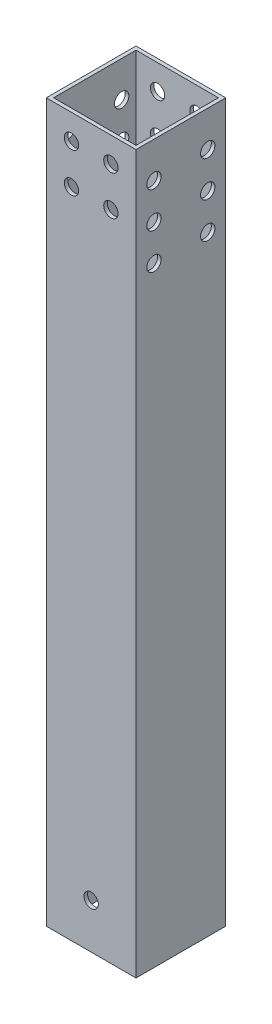
ISO-10303-21;
HEADER;
FILE_DESCRIPTION(('STEP AP214'),'2;1');
FILE_NAME('part.step','',(''),(''),'','','');
FILE_SCHEMA(('AUTOMOTIVE_DESIGN { 1 0 10303 214 1 1 1 1 }'));
ENDSEC;
DATA;
#1=APPLICATION_CONTEXT('core data for automotive mechanical design processes');
#2=APPLICATION_PROTOCOL_DEFINITION('international standard','automotive_design',2000,#1);
#3=PRODUCT_CONTEXT('',#1,'mechanical');
#4=PRODUCT('Part','Part','',(#3));
#5=PRODUCT_RELATED_PRODUCT_CATEGORY('part','',(#4));
#6=PRODUCT_DEFINITION_FORMATION('','',#4);
#7=PRODUCT_DEFINITION_CONTEXT('part definition',#1,'design');
#8=PRODUCT_DEFINITION('design','',#6,#7);
#9=PRODUCT_DEFINITION_SHAPE('','',#8);
#10=(LENGTH_UNIT() NAMED_UNIT(*) SI_UNIT(.MILLI.,.METRE.));
#11=(NAMED_UNIT(*) PLANE_ANGLE_UNIT() SI_UNIT($,.RADIAN.));
#12=(NAMED_UNIT(*) SI_UNIT($,.STERADIAN.) SOLID_ANGLE_UNIT());
#13=UNCERTAINTY_MEASURE_WITH_UNIT(LENGTH_MEASURE(1.E-05),#10,'distance_accuracy_value','');
#14=(GEOMETRIC_REPRESENTATION_CONTEXT(3) GLOBAL_UNCERTAINTY_ASSIGNED_CONTEXT((#13)) GLOBAL_UNIT_ASSIGNED_CONTEXT((#10,
#11,#12)) REPRESENTATION_CONTEXT('',''));
#15=CARTESIAN_POINT('',(0.,0.,0.));
#16=DIRECTION('',(0.,0.,1.));
#17=DIRECTION('',(1.,0.,0.));
#18=AXIS2_PLACEMENT_3D('',#15,#16,#17);
#19=CARTESIAN_POINT('',(0.,200.,0.));
#20=DIRECTION('',(0.,1.,0.));
#21=DIRECTION('',(0.,0.,1.));
#22=AXIS2_PLACEMENT_3D('',#19,#20,#21);
#23=PLANE('',#22);
#24=DIRECTION('',(0.,0.,-1.));
#25=VECTOR('',#24,1.);
#26=CARTESIAN_POINT('',(12.5,200.,-12.5));
#27=LINE('',#26,#25);
#28=CARTESIAN_POINT('',(12.5,200.,12.5));
#29=VERTEX_POINT('',#28);
#30=CARTESIAN_POINT('',(12.5,200.,-12.5));
#31=VERTEX_POINT('',#30);
#32=EDGE_CURVE('E139',#29,#31,#27,.T.);
#33=ORIENTED_EDGE('',*,*,#32,.T.);
#34=DIRECTION('',(-1.,0.,0.));
#35=VECTOR('',#34,1.);
#36=CARTESIAN_POINT('',(-12.5,200.,-12.5));
#37=LINE('',#36,#35);
#38=CARTESIAN_POINT('',(-12.5,200.,-12.5));
#39=VERTEX_POINT('',#38);
#40=EDGE_CURVE('E142',#31,#39,#37,.T.);
#41=ORIENTED_EDGE('',*,*,#40,.T.);
#42=DIRECTION('',(0.,0.,1.));
#43=VECTOR('',#42,1.);
#44=CARTESIAN_POINT('',(-12.5,200.,-12.5));
#45=LINE('',#44,#43);
#46=CARTESIAN_POINT('',(-12.5,200.,12.5));
#47=VERTEX_POINT('',#46);
#48=EDGE_CURVE('E145',#39,#47,#45,.T.);
#49=ORIENTED_EDGE('',*,*,#48,.T.);
#50=DIRECTION('',(1.,0.,0.));
#51=VECTOR('',#50,1.);
#52=CARTESIAN_POINT('',(-12.5,200.,12.5));
#53=LINE('',#52,#51);
#54=EDGE_CURVE('E147',#47,#29,#53,.T.);
#55=ORIENTED_EDGE('',*,*,#54,.T.);
#56=EDGE_LOOP('',(#33,#41,#49,#55));
#57=FACE_BOUND('',#56,.T.);
#58=DIRECTION('',(1.,0.,0.));
#59=VECTOR('',#58,1.);
#60=CARTESIAN_POINT('',(-11.5,200.,11.5));
#61=LINE('',#60,#59);
#62=CARTESIAN_POINT('',(-11.5,200.,11.5));
#63=VERTEX_POINT('',#62);
#64=CARTESIAN_POINT('',(11.5,200.,11.5));
#65=VERTEX_POINT('',#64);
#66=EDGE_CURVE('E109',#63,#65,#61,.T.);
#67=ORIENTED_EDGE('',*,*,#66,.F.);
#68=DIRECTION('',(0.,0.,1.));
#69=VECTOR('',#68,1.);
#70=CARTESIAN_POINT('',(-11.5,200.,-11.5));
#71=LINE('',#70,#69);
#72=CARTESIAN_POINT('',(-11.5,200.,-11.5));
#73=VERTEX_POINT('',#72);
#74=EDGE_CURVE('E101',#73,#63,#71,.T.);
#75=ORIENTED_EDGE('',*,*,#74,.F.);
#76=DIRECTION('',(-1.,0.,0.));
#77=VECTOR('',#76,1.);
#78=CARTESIAN_POINT('',(-11.5,200.,-11.5));
#79=LINE('',#78,#77);
#80=CARTESIAN_POINT('',(11.5,200.,-11.5));
#81=VERTEX_POINT('',#80);
#82=EDGE_CURVE('E123',#81,#73,#79,.T.);
#83=ORIENTED_EDGE('',*,*,#82,.F.);
#84=DIRECTION('',(0.,0.,-1.));
#85=VECTOR('',#84,1.);
#86=CARTESIAN_POINT('',(11.5,200.,-11.5));
#87=LINE('',#86,#85);
#88=EDGE_CURVE('E121',#65,#81,#87,.T.);
#89=ORIENTED_EDGE('',*,*,#88,.F.);
#90=EDGE_LOOP('',(#67,#75,#83,#89));
#91=FACE_BOUND('',#90,.T.);
#92=ADVANCED_FACE('F34',(#57,#91),#23,.T.);
#93=CARTESIAN_POINT('',(0.,0.,0.));
#94=DIRECTION('',(0.,1.,0.));
#95=DIRECTION('',(0.,0.,1.));
#96=AXIS2_PLACEMENT_3D('',#93,#94,#95);
#97=PLANE('',#96);
#98=DIRECTION('',(0.,0.,-1.));
#99=VECTOR('',#98,1.);
#100=CARTESIAN_POINT('',(12.5,0.,-12.5));
#101=LINE('',#100,#99);
#102=CARTESIAN_POINT('',(12.5,0.,12.5));
#103=VERTEX_POINT('',#102);
#104=CARTESIAN_POINT('',(12.5,0.,-12.5));
#105=VERTEX_POINT('',#104);
#106=EDGE_CURVE('E117',#103,#105,#101,.T.);
#107=ORIENTED_EDGE('',*,*,#106,.F.);
#108=DIRECTION('',(1.,0.,0.));
#109=VECTOR('',#108,1.);
#110=CARTESIAN_POINT('',(-12.5,0.,12.5));
#111=LINE('',#110,#109);
#112=CARTESIAN_POINT('',(-12.5,0.,12.5));
#113=VERTEX_POINT('',#112);
#114=EDGE_CURVE('E143',#113,#103,#111,.T.);
#115=ORIENTED_EDGE('',*,*,#114,.F.);
#116=DIRECTION('',(0.,0.,1.));
#117=VECTOR('',#116,1.);
#118=CARTESIAN_POINT('',(-12.5,0.,-12.5));
#119=LINE('',#118,#117);
#120=CARTESIAN_POINT('',(-12.5,0.,-12.5));
#121=VERTEX_POINT('',#120);
#122=EDGE_CURVE('E154',#121,#113,#119,.T.);
#123=ORIENTED_EDGE('',*,*,#122,.F.);
#124=DIRECTION('',(-1.,0.,0.));
#125=VECTOR('',#124,1.);
#126=CARTESIAN_POINT('',(-12.5,0.,-12.5));
#127=LINE('',#126,#125);
#128=EDGE_CURVE('E152',#105,#121,#127,.T.);
#129=ORIENTED_EDGE('',*,*,#128,.F.);
#130=EDGE_LOOP('',(#107,#115,#123,#129));
#131=FACE_BOUND('',#130,.T.);
#132=DIRECTION('',(0.,0.,1.));
#133=VECTOR('',#132,1.);
#134=CARTESIAN_POINT('',(-11.5,0.,-11.5));
#135=LINE('',#134,#133);
#136=CARTESIAN_POINT('',(-11.5,0.,-11.5));
#137=VERTEX_POINT('',#136);
#138=CARTESIAN_POINT('',(-11.5,0.,11.5));
#139=VERTEX_POINT('',#138);
#140=EDGE_CURVE('E59',#137,#139,#135,.T.);
#141=ORIENTED_EDGE('',*,*,#140,.T.);
#142=DIRECTION('',(1.,0.,0.));
#143=VECTOR('',#142,1.);
#144=CARTESIAN_POINT('',(-11.5,0.,11.5));
#145=LINE('',#144,#143);
#146=CARTESIAN_POINT('',(11.5,0.,11.5));
#147=VERTEX_POINT('',#146);
#148=EDGE_CURVE('E116',#139,#147,#145,.T.);
#149=ORIENTED_EDGE('',*,*,#148,.T.);
#150=DIRECTION('',(0.,0.,-1.));
#151=VECTOR('',#150,1.);
#152=CARTESIAN_POINT('',(11.5,0.,-11.5));
#153=LINE('',#152,#151);
#154=CARTESIAN_POINT('',(11.5,0.,-11.5));
#155=VERTEX_POINT('',#154);
#156=EDGE_CURVE('E131',#147,#155,#153,.T.);
#157=ORIENTED_EDGE('',*,*,#156,.T.);
#158=DIRECTION('',(-1.,0.,0.));
#159=VECTOR('',#158,1.);
#160=CARTESIAN_POINT('',(-11.5,0.,-11.5));
#161=LINE('',#160,#159);
#162=EDGE_CURVE('E110',#155,#137,#161,.T.);
#163=ORIENTED_EDGE('',*,*,#162,.T.);
#164=EDGE_LOOP('',(#141,#149,#157,#163));
#165=FACE_BOUND('',#164,.T.);
#166=ADVANCED_FACE('F337',(#131,#165),#97,.F.);
#167=CARTESIAN_POINT('',(12.5,200.,-12.5));
#168=DIRECTION('',(-1.,0.,0.));
#169=DIRECTION('',(0.,0.,1.));
#170=AXIS2_PLACEMENT_3D('',#167,#168,#169);
#171=PLANE('',#170);
#172=CARTESIAN_POINT('',(12.5,180.,-7.5));
#173=DIRECTION('',(1.,0.,0.));
#174=DIRECTION('',(0.,0.,-1.));
#175=AXIS2_PLACEMENT_3D('',#172,#173,#174);
#176=CIRCLE('',#175,2.);
#177=CARTESIAN_POINT('',(12.5,180.,-9.5));
#178=VERTEX_POINT('',#177);
#179=EDGE_CURVE('E259',#178,#178,#176,.T.);
#180=ORIENTED_EDGE('',*,*,#179,.F.);
#181=EDGE_LOOP('',(#180));
#182=FACE_BOUND('',#181,.T.);
#183=CARTESIAN_POINT('',(12.5,170.,-7.5));
#184=DIRECTION('',(1.,0.,0.));
#185=DIRECTION('',(0.,0.,-1.));
#186=AXIS2_PLACEMENT_3D('',#183,#184,#185);
#187=CIRCLE('',#186,2.);
#188=CARTESIAN_POINT('',(12.5,170.,-9.5));
#189=VERTEX_POINT('',#188);
#190=EDGE_CURVE('E265',#189,#189,#187,.T.);
#191=ORIENTED_EDGE('',*,*,#190,.F.);
#192=EDGE_LOOP('',(#191));
#193=FACE_BOUND('',#192,.T.);
#194=CARTESIAN_POINT('',(12.5,190.,7.5));
#195=DIRECTION('',(1.,0.,0.));
#196=DIRECTION('',(0.,0.,-1.));
#197=AXIS2_PLACEMENT_3D('',#194,#195,#196);
#198=CIRCLE('',#197,2.);
#199=CARTESIAN_POINT('',(12.5,190.,5.5));
#200=VERTEX_POINT('',#199);
#201=EDGE_CURVE('E271',#200,#200,#198,.T.);
#202=ORIENTED_EDGE('',*,*,#201,.F.);
#203=EDGE_LOOP('',(#202));
#204=FACE_BOUND('',#203,.T.);
#205=CARTESIAN_POINT('',(12.5,180.,7.5));
#206=DIRECTION('',(1.,0.,0.));
#207=DIRECTION('',(0.,0.,-1.));
#208=AXIS2_PLACEMENT_3D('',#205,#206,#207);
#209=CIRCLE('',#208,2.);
#210=CARTESIAN_POINT('',(12.5,180.,5.5));
#211=VERTEX_POINT('',#210);
#212=EDGE_CURVE('E252',#211,#211,#209,.T.);
#213=ORIENTED_EDGE('',*,*,#212,.F.);
#214=EDGE_LOOP('',(#213));
#215=FACE_BOUND('',#214,.T.);
#216=CARTESIAN_POINT('',(12.5,170.,7.5));
#217=DIRECTION('',(1.,0.,0.));
#218=DIRECTION('',(0.,0.,-1.));
#219=AXIS2_PLACEMENT_3D('',#216,#217,#218);
#220=CIRCLE('',#219,2.);
#221=CARTESIAN_POINT('',(12.5,170.,5.5));
#222=VERTEX_POINT('',#221);
#223=EDGE_CURVE('E248',#222,#222,#220,.T.);
#224=ORIENTED_EDGE('',*,*,#223,.F.);
#225=EDGE_LOOP('',(#224));
#226=FACE_BOUND('',#225,.T.);
#227=CARTESIAN_POINT('',(12.5,190.,-7.5));
#228=DIRECTION('',(1.,0.,0.));
#229=DIRECTION('',(0.,0.,-1.));
#230=AXIS2_PLACEMENT_3D('',#227,#228,#229);
#231=CIRCLE('',#230,2.);
#232=CARTESIAN_POINT('',(12.5,190.,-9.5));
#233=VERTEX_POINT('',#232);
#234=EDGE_CURVE('E258',#233,#233,#231,.T.);
#235=ORIENTED_EDGE('',*,*,#234,.F.);
#236=EDGE_LOOP('',(#235));
#237=FACE_BOUND('',#236,.T.);
#238=ORIENTED_EDGE('',*,*,#106,.T.);
#239=DIRECTION('',(0.,-1.,0.));
#240=VECTOR('',#239,1.);
#241=CARTESIAN_POINT('',(12.5,200.,-12.5));
#242=LINE('',#241,#240);
#243=EDGE_CURVE('E11',#31,#105,#242,.T.);
#244=ORIENTED_EDGE('',*,*,#243,.F.);
#245=ORIENTED_EDGE('',*,*,#32,.F.);
#246=DIRECTION('',(0.,-1.,0.));
#247=VECTOR('',#246,1.);
#248=CARTESIAN_POINT('',(12.5,200.,12.5));
#249=LINE('',#248,#247);
#250=EDGE_CURVE('E149',#29,#103,#249,.T.);
#251=ORIENTED_EDGE('',*,*,#250,.T.);
#252=EDGE_LOOP('',(#238,#244,#245,#251));
#253=FACE_BOUND('',#252,.T.);
#254=ADVANCED_FACE('F36',(#182,#193,#204,#215,#226,#237,#253),#171,.F.);
#255=CARTESIAN_POINT('',(-12.5,200.,-12.5));
#256=DIRECTION('',(0.,0.,1.));
#257=DIRECTION('',(1.,0.,0.));
#258=AXIS2_PLACEMENT_3D('',#255,#256,#257);
#259=PLANE('',#258);
#260=CARTESIAN_POINT('',(-5.50000000000001,193.,-12.5));
#261=DIRECTION('',(0.,0.,-1.));
#262=DIRECTION('',(-1.,0.,0.));
#263=AXIS2_PLACEMENT_3D('',#260,#261,#262);
#264=CIRCLE('',#263,2.);
#265=CARTESIAN_POINT('',(-7.50000000000001,193.,-12.5));
#266=VERTEX_POINT('',#265);
#267=EDGE_CURVE('E204',#266,#266,#264,.T.);
#268=ORIENTED_EDGE('',*,*,#267,.F.);
#269=EDGE_LOOP('',(#268));
#270=FACE_BOUND('',#269,.T.);
#271=CARTESIAN_POINT('',(-5.50000000000001,182.,-12.5));
#272=DIRECTION('',(0.,0.,-1.));
#273=DIRECTION('',(-1.,0.,0.));
#274=AXIS2_PLACEMENT_3D('',#271,#272,#273);
#275=CIRCLE('',#274,2.);
#276=CARTESIAN_POINT('',(-7.50000000000001,182.,-12.5));
#277=VERTEX_POINT('',#276);
#278=EDGE_CURVE('E215',#277,#277,#275,.T.);
#279=ORIENTED_EDGE('',*,*,#278,.F.);
#280=EDGE_LOOP('',(#279));
#281=FACE_BOUND('',#280,.T.);
#282=CARTESIAN_POINT('',(0.,12.5,-12.5));
#283=DIRECTION('',(0.,0.,1.));
#284=DIRECTION('',(1.,0.,0.));
#285=AXIS2_PLACEMENT_3D('',#282,#283,#284);
#286=CIRCLE('',#285,2.);
#287=CARTESIAN_POINT('',(2.,12.5,-12.5));
#288=VERTEX_POINT('',#287);
#289=EDGE_CURVE('E200',#288,#288,#286,.T.);
#290=ORIENTED_EDGE('',*,*,#289,.T.);
#291=EDGE_LOOP('',(#290));
#292=FACE_BOUND('',#291,.T.);
#293=CARTESIAN_POINT('',(5.50000000000001,193.,-12.5));
#294=DIRECTION('',(0.,0.,1.));
#295=DIRECTION('',(1.,0.,0.));
#296=AXIS2_PLACEMENT_3D('',#293,#294,#295);
#297=CIRCLE('',#296,2.);
#298=CARTESIAN_POINT('',(7.50000000000001,193.,-12.5));
#299=VERTEX_POINT('',#298);
#300=EDGE_CURVE('E192',#299,#299,#297,.T.);
#301=ORIENTED_EDGE('',*,*,#300,.T.);
#302=EDGE_LOOP('',(#301));
#303=FACE_BOUND('',#302,.T.);
#304=CARTESIAN_POINT('',(5.50000000000001,182.,-12.5));
#305=DIRECTION('',(0.,0.,1.));
#306=DIRECTION('',(1.,0.,0.));
#307=AXIS2_PLACEMENT_3D('',#304,#305,#306);
#308=CIRCLE('',#307,2.);
#309=CARTESIAN_POINT('',(7.50000000000001,182.,-12.5));
#310=VERTEX_POINT('',#309);
#311=EDGE_CURVE('E239',#310,#310,#308,.T.);
#312=ORIENTED_EDGE('',*,*,#311,.T.);
#313=EDGE_LOOP('',(#312));
#314=FACE_BOUND('',#313,.T.);
#315=ORIENTED_EDGE('',*,*,#128,.T.);
#316=DIRECTION('',(0.,-1.,0.));
#317=VECTOR('',#316,1.);
#318=CARTESIAN_POINT('',(-12.5,200.,-12.5));
#319=LINE('',#318,#317);
#320=EDGE_CURVE('E43',#39,#121,#319,.T.);
#321=ORIENTED_EDGE('',*,*,#320,.F.);
#322=ORIENTED_EDGE('',*,*,#40,.F.);
#323=ORIENTED_EDGE('',*,*,#243,.T.);
#324=EDGE_LOOP('',(#315,#321,#322,#323));
#325=FACE_BOUND('',#324,.T.);
#326=ADVANCED_FACE('F324',(#270,#281,#292,#303,#314,#325),#259,.F.);
#327=CARTESIAN_POINT('',(-12.5,200.,-12.5));
#328=DIRECTION('',(1.,0.,0.));
#329=DIRECTION('',(0.,0.,-1.));
#330=AXIS2_PLACEMENT_3D('',#327,#328,#329);
#331=PLANE('',#330);
#332=CARTESIAN_POINT('',(-12.5,180.,-7.5));
#333=DIRECTION('',(1.,0.,0.));
#334=DIRECTION('',(0.,0.,-1.));
#335=AXIS2_PLACEMENT_3D('',#332,#333,#334);
#336=CIRCLE('',#335,2.);
#337=CARTESIAN_POINT('',(-12.5,180.,-9.5));
#338=VERTEX_POINT('',#337);
#339=EDGE_CURVE('E255',#338,#338,#336,.T.);
#340=ORIENTED_EDGE('',*,*,#339,.T.);
#341=EDGE_LOOP('',(#340));
#342=FACE_BOUND('',#341,.T.);
#343=CARTESIAN_POINT('',(-12.5,170.,-7.5));
#344=DIRECTION('',(1.,0.,0.));
#345=DIRECTION('',(0.,0.,-1.));
#346=AXIS2_PLACEMENT_3D('',#343,#344,#345);
#347=CIRCLE('',#346,2.);
#348=CARTESIAN_POINT('',(-12.5,170.,-9.5));
#349=VERTEX_POINT('',#348);
#350=EDGE_CURVE('E262',#349,#349,#347,.T.);
#351=ORIENTED_EDGE('',*,*,#350,.T.);
#352=EDGE_LOOP('',(#351));
#353=FACE_BOUND('',#352,.T.);
#354=CARTESIAN_POINT('',(-12.5,190.,7.5));
#355=DIRECTION('',(1.,0.,0.));
#356=DIRECTION('',(0.,0.,-1.));
#357=AXIS2_PLACEMENT_3D('',#354,#355,#356);
#358=CIRCLE('',#357,2.);
#359=CARTESIAN_POINT('',(-12.5,190.,5.5));
#360=VERTEX_POINT('',#359);
#361=EDGE_CURVE('E268',#360,#360,#358,.T.);
#362=ORIENTED_EDGE('',*,*,#361,.T.);
#363=EDGE_LOOP('',(#362));
#364=FACE_BOUND('',#363,.T.);
#365=CARTESIAN_POINT('',(-12.5,180.,7.5));
#366=DIRECTION('',(1.,0.,0.));
#367=DIRECTION('',(0.,0.,-1.));
#368=AXIS2_PLACEMENT_3D('',#365,#366,#367);
#369=CIRCLE('',#368,2.);
#370=CARTESIAN_POINT('',(-12.5,180.,5.5));
#371=VERTEX_POINT('',#370);
#372=EDGE_CURVE('E274',#371,#371,#369,.T.);
#373=ORIENTED_EDGE('',*,*,#372,.T.);
#374=EDGE_LOOP('',(#373));
#375=FACE_BOUND('',#374,.T.);
#376=CARTESIAN_POINT('',(-12.5,170.,7.5));
#377=DIRECTION('',(1.,0.,0.));
#378=DIRECTION('',(0.,0.,-1.));
#379=AXIS2_PLACEMENT_3D('',#376,#377,#378);
#380=CIRCLE('',#379,2.);
#381=CARTESIAN_POINT('',(-12.5,170.,5.5));
#382=VERTEX_POINT('',#381);
#383=EDGE_CURVE('E249',#382,#382,#380,.T.);
#384=ORIENTED_EDGE('',*,*,#383,.T.);
#385=EDGE_LOOP('',(#384));
#386=FACE_BOUND('',#385,.T.);
#387=CARTESIAN_POINT('',(-12.5,190.,-7.5));
#388=DIRECTION('',(1.,0.,0.));
#389=DIRECTION('',(0.,0.,-1.));
#390=AXIS2_PLACEMENT_3D('',#387,#388,#389);
#391=CIRCLE('',#390,2.);
#392=CARTESIAN_POINT('',(-12.5,190.,-9.5));
#393=VERTEX_POINT('',#392);
#394=EDGE_CURVE('E168',#393,#393,#391,.T.);
#395=ORIENTED_EDGE('',*,*,#394,.T.);
#396=EDGE_LOOP('',(#395));
#397=FACE_BOUND('',#396,.T.);
#398=ORIENTED_EDGE('',*,*,#122,.T.);
#399=DIRECTION('',(0.,-1.,0.));
#400=VECTOR('',#399,1.);
#401=CARTESIAN_POINT('',(-12.5,200.,12.5));
#402=LINE('',#401,#400);
#403=EDGE_CURVE('E159',#47,#113,#402,.T.);
#404=ORIENTED_EDGE('',*,*,#403,.F.);
#405=ORIENTED_EDGE('',*,*,#48,.F.);
#406=ORIENTED_EDGE('',*,*,#320,.T.);
#407=EDGE_LOOP('',(#398,#404,#405,#406));
#408=FACE_BOUND('',#407,.T.);
#409=ADVANCED_FACE('F321',(#342,#353,#364,#375,#386,#397,#408),#331,.F.);
#410=CARTESIAN_POINT('',(-12.5,200.,12.5));
#411=DIRECTION('',(0.,0.,-1.));
#412=DIRECTION('',(-1.,0.,0.));
#413=AXIS2_PLACEMENT_3D('',#410,#411,#412);
#414=PLANE('',#413);
#415=CARTESIAN_POINT('',(-5.50000000000001,193.,12.5));
#416=DIRECTION('',(0.,0.,-1.));
#417=DIRECTION('',(-1.,0.,0.));
#418=AXIS2_PLACEMENT_3D('',#415,#416,#417);
#419=CIRCLE('',#418,2.);
#420=CARTESIAN_POINT('',(-7.50000000000001,193.,12.5));
#421=VERTEX_POINT('',#420);
#422=EDGE_CURVE('E210',#421,#421,#419,.T.);
#423=ORIENTED_EDGE('',*,*,#422,.T.);
#424=EDGE_LOOP('',(#423));
#425=FACE_BOUND('',#424,.T.);
#426=CARTESIAN_POINT('',(-5.50000000000001,182.,12.5));
#427=DIRECTION('',(0.,0.,-1.));
#428=DIRECTION('',(-1.,0.,0.));
#429=AXIS2_PLACEMENT_3D('',#426,#427,#428);
#430=CIRCLE('',#429,2.);
#431=CARTESIAN_POINT('',(-7.50000000000001,182.,12.5));
#432=VERTEX_POINT('',#431);
#433=EDGE_CURVE('E220',#432,#432,#430,.T.);
#434=ORIENTED_EDGE('',*,*,#433,.T.);
#435=EDGE_LOOP('',(#434));
#436=FACE_BOUND('',#435,.T.);
#437=CARTESIAN_POINT('',(0.,12.5,12.5));
#438=DIRECTION('',(0.,0.,1.));
#439=DIRECTION('',(1.,0.,0.));
#440=AXIS2_PLACEMENT_3D('',#437,#438,#439);
#441=CIRCLE('',#440,2.);
#442=CARTESIAN_POINT('',(2.,12.5,12.5));
#443=VERTEX_POINT('',#442);
#444=EDGE_CURVE('E226',#443,#443,#441,.T.);
#445=ORIENTED_EDGE('',*,*,#444,.F.);
#446=EDGE_LOOP('',(#445));
#447=FACE_BOUND('',#446,.T.);
#448=CARTESIAN_POINT('',(5.50000000000001,193.,12.5));
#449=DIRECTION('',(0.,0.,1.));
#450=DIRECTION('',(1.,0.,0.));
#451=AXIS2_PLACEMENT_3D('',#448,#449,#450);
#452=CIRCLE('',#451,2.);
#453=CARTESIAN_POINT('',(7.50000000000001,193.,12.5));
#454=VERTEX_POINT('',#453);
#455=EDGE_CURVE('E236',#454,#454,#452,.T.);
#456=ORIENTED_EDGE('',*,*,#455,.F.);
#457=EDGE_LOOP('',(#456));
#458=FACE_BOUND('',#457,.T.);
#459=CARTESIAN_POINT('',(5.50000000000001,182.,12.5));
#460=DIRECTION('',(0.,0.,1.));
#461=DIRECTION('',(1.,0.,0.));
#462=AXIS2_PLACEMENT_3D('',#459,#460,#461);
#463=CIRCLE('',#462,2.);
#464=CARTESIAN_POINT('',(7.50000000000001,182.,12.5));
#465=VERTEX_POINT('',#464);
#466=EDGE_CURVE('E233',#465,#465,#463,.T.);
#467=ORIENTED_EDGE('',*,*,#466,.F.);
#468=EDGE_LOOP('',(#467));
#469=FACE_BOUND('',#468,.T.);
#470=ORIENTED_EDGE('',*,*,#114,.T.);
#471=ORIENTED_EDGE('',*,*,#250,.F.);
#472=ORIENTED_EDGE('',*,*,#54,.F.);
#473=ORIENTED_EDGE('',*,*,#403,.T.);
#474=EDGE_LOOP('',(#470,#471,#472,#473));
#475=FACE_BOUND('',#474,.T.);
#476=ADVANCED_FACE('F300',(#425,#436,#447,#458,#469,#475),#414,.F.);
#477=CARTESIAN_POINT('',(-11.5,200.,-11.5));
#478=DIRECTION('',(1.,0.,0.));
#479=DIRECTION('',(0.,0.,-1.));
#480=AXIS2_PLACEMENT_3D('',#477,#478,#479);
#481=PLANE('',#480);
#482=CARTESIAN_POINT('',(-11.5,180.,-7.5));
#483=DIRECTION('',(1.,0.,0.));
#484=DIRECTION('',(0.,0.,-1.));
#485=AXIS2_PLACEMENT_3D('',#482,#483,#484);
#486=CIRCLE('',#485,2.);
#487=CARTESIAN_POINT('',(-11.5,180.,-9.5));
#488=VERTEX_POINT('',#487);
#489=EDGE_CURVE('E129',#488,#488,#486,.T.);
#490=ORIENTED_EDGE('',*,*,#489,.F.);
#491=EDGE_LOOP('',(#490));
#492=FACE_BOUND('',#491,.T.);
#493=CARTESIAN_POINT('',(-11.5,170.,-7.5));
#494=DIRECTION('',(1.,0.,0.));
#495=DIRECTION('',(0.,0.,-1.));
#496=AXIS2_PLACEMENT_3D('',#493,#494,#495);
#497=CIRCLE('',#496,2.);
#498=CARTESIAN_POINT('',(-11.5,170.,-9.5));
#499=VERTEX_POINT('',#498);
#500=EDGE_CURVE('E184',#499,#499,#497,.T.);
#501=ORIENTED_EDGE('',*,*,#500,.F.);
#502=EDGE_LOOP('',(#501));
#503=FACE_BOUND('',#502,.T.);
#504=CARTESIAN_POINT('',(-11.5,190.,7.5));
#505=DIRECTION('',(1.,0.,0.));
#506=DIRECTION('',(0.,0.,-1.));
#507=AXIS2_PLACEMENT_3D('',#504,#505,#506);
#508=CIRCLE('',#507,2.);
#509=CARTESIAN_POINT('',(-11.5,190.,5.5));
#510=VERTEX_POINT('',#509);
#511=EDGE_CURVE('E180',#510,#510,#508,.T.);
#512=ORIENTED_EDGE('',*,*,#511,.F.);
#513=EDGE_LOOP('',(#512));
#514=FACE_BOUND('',#513,.T.);
#515=CARTESIAN_POINT('',(-11.5,180.,7.5));
#516=DIRECTION('',(1.,0.,0.));
#517=DIRECTION('',(0.,0.,-1.));
#518=AXIS2_PLACEMENT_3D('',#515,#516,#517);
#519=CIRCLE('',#518,2.);
#520=CARTESIAN_POINT('',(-11.5,180.,5.5));
#521=VERTEX_POINT('',#520);
#522=EDGE_CURVE('E176',#521,#521,#519,.T.);
#523=ORIENTED_EDGE('',*,*,#522,.F.);
#524=EDGE_LOOP('',(#523));
#525=FACE_BOUND('',#524,.T.);
#526=CARTESIAN_POINT('',(-11.5,170.,7.5));
#527=DIRECTION('',(1.,0.,0.));
#528=DIRECTION('',(0.,0.,-1.));
#529=AXIS2_PLACEMENT_3D('',#526,#527,#528);
#530=CIRCLE('',#529,2.);
#531=CARTESIAN_POINT('',(-11.5,170.,5.5));
#532=VERTEX_POINT('',#531);
#533=EDGE_CURVE('E172',#532,#532,#530,.T.);
#534=ORIENTED_EDGE('',*,*,#533,.F.);
#535=EDGE_LOOP('',(#534));
#536=FACE_BOUND('',#535,.T.);
#537=CARTESIAN_POINT('',(-11.5,190.,-7.5));
#538=DIRECTION('',(1.,0.,0.));
#539=DIRECTION('',(0.,0.,-1.));
#540=AXIS2_PLACEMENT_3D('',#537,#538,#539);
#541=CIRCLE('',#540,2.);
#542=CARTESIAN_POINT('',(-11.5,190.,-9.5));
#543=VERTEX_POINT('',#542);
#544=EDGE_CURVE('E167',#543,#543,#541,.T.);
#545=ORIENTED_EDGE('',*,*,#544,.F.);
#546=EDGE_LOOP('',(#545));
#547=FACE_BOUND('',#546,.T.);
#548=ORIENTED_EDGE('',*,*,#140,.F.);
#549=DIRECTION('',(0.,-1.,0.));
#550=VECTOR('',#549,1.);
#551=CARTESIAN_POINT('',(-11.5,200.,-11.5));
#552=LINE('',#551,#550);
#553=EDGE_CURVE('E105',#73,#137,#552,.T.);
#554=ORIENTED_EDGE('',*,*,#553,.F.);
#555=ORIENTED_EDGE('',*,*,#74,.T.);
#556=DIRECTION('',(0.,-1.,0.));
#557=VECTOR('',#556,1.);
#558=CARTESIAN_POINT('',(-11.5,200.,11.5));
#559=LINE('',#558,#557);
#560=EDGE_CURVE('E104',#63,#139,#559,.T.);
#561=ORIENTED_EDGE('',*,*,#560,.T.);
#562=EDGE_LOOP('',(#548,#554,#555,#561));
#563=FACE_BOUND('',#562,.T.);
#564=ADVANCED_FACE('F103',(#492,#503,#514,#525,#536,#547,#563),#481,.T.);
#565=CARTESIAN_POINT('',(-11.5,200.,11.5));
#566=DIRECTION('',(0.,0.,-1.));
#567=DIRECTION('',(-1.,0.,0.));
#568=AXIS2_PLACEMENT_3D('',#565,#566,#567);
#569=PLANE('',#568);
#570=CARTESIAN_POINT('',(-5.50000000000001,193.,11.5));
#571=DIRECTION('',(0.,0.,-1.));
#572=DIRECTION('',(-1.,0.,0.));
#573=AXIS2_PLACEMENT_3D('',#570,#571,#572);
#574=CIRCLE('',#573,2.);
#575=CARTESIAN_POINT('',(-7.50000000000001,193.,11.5));
#576=VERTEX_POINT('',#575);
#577=EDGE_CURVE('E223',#576,#576,#574,.F.);
#578=ORIENTED_EDGE('',*,*,#577,.T.);
#579=EDGE_LOOP('',(#578));
#580=FACE_BOUND('',#579,.T.);
#581=CARTESIAN_POINT('',(-5.50000000000001,182.,11.5));
#582=DIRECTION('',(0.,0.,-1.));
#583=DIRECTION('',(-1.,0.,0.));
#584=AXIS2_PLACEMENT_3D('',#581,#582,#583);
#585=CIRCLE('',#584,2.);
#586=CARTESIAN_POINT('',(-7.50000000000001,182.,11.5));
#587=VERTEX_POINT('',#586);
#588=EDGE_CURVE('E203',#587,#587,#585,.F.);
#589=ORIENTED_EDGE('',*,*,#588,.T.);
#590=EDGE_LOOP('',(#589));
#591=FACE_BOUND('',#590,.T.);
#592=CARTESIAN_POINT('',(0.,12.5,11.5));
#593=DIRECTION('',(0.,0.,-1.));
#594=DIRECTION('',(-1.,0.,0.));
#595=AXIS2_PLACEMENT_3D('',#592,#593,#594);
#596=CIRCLE('',#595,2.);
#597=CARTESIAN_POINT('',(-2.,12.5,11.5));
#598=VERTEX_POINT('',#597);
#599=EDGE_CURVE('E199',#598,#598,#596,.T.);
#600=ORIENTED_EDGE('',*,*,#599,.F.);
#601=EDGE_LOOP('',(#600));
#602=FACE_BOUND('',#601,.T.);
#603=CARTESIAN_POINT('',(5.50000000000001,193.,11.5));
#604=DIRECTION('',(0.,0.,-1.));
#605=DIRECTION('',(-1.,0.,0.));
#606=AXIS2_PLACEMENT_3D('',#603,#604,#605);
#607=CIRCLE('',#606,2.);
#608=CARTESIAN_POINT('',(3.5,193.,11.5));
#609=VERTEX_POINT('',#608);
#610=EDGE_CURVE('E196',#609,#609,#607,.T.);
#611=ORIENTED_EDGE('',*,*,#610,.F.);
#612=EDGE_LOOP('',(#611));
#613=FACE_BOUND('',#612,.T.);
#614=CARTESIAN_POINT('',(5.50000000000001,182.,11.5));
#615=DIRECTION('',(0.,0.,-1.));
#616=DIRECTION('',(-1.,0.,0.));
#617=AXIS2_PLACEMENT_3D('',#614,#615,#616);
#618=CIRCLE('',#617,2.);
#619=CARTESIAN_POINT('',(3.5,182.,11.5));
#620=VERTEX_POINT('',#619);
#621=EDGE_CURVE('E191',#620,#620,#618,.T.);
#622=ORIENTED_EDGE('',*,*,#621,.F.);
#623=EDGE_LOOP('',(#622));
#624=FACE_BOUND('',#623,.T.);
#625=ORIENTED_EDGE('',*,*,#148,.F.);
#626=ORIENTED_EDGE('',*,*,#560,.F.);
#627=ORIENTED_EDGE('',*,*,#66,.T.);
#628=DIRECTION('',(0.,-1.,0.));
#629=VECTOR('',#628,1.);
#630=CARTESIAN_POINT('',(11.5,200.,11.5));
#631=LINE('',#630,#629);
#632=EDGE_CURVE('E118',#65,#147,#631,.T.);
#633=ORIENTED_EDGE('',*,*,#632,.T.);
#634=EDGE_LOOP('',(#625,#626,#627,#633));
#635=FACE_BOUND('',#634,.T.);
#636=ADVANCED_FACE('F113',(#580,#591,#602,#613,#624,#635),#569,.T.);
#637=CARTESIAN_POINT('',(11.5,200.,-11.5));
#638=DIRECTION('',(-1.,0.,0.));
#639=DIRECTION('',(0.,0.,1.));
#640=AXIS2_PLACEMENT_3D('',#637,#638,#639);
#641=PLANE('',#640);
#642=CARTESIAN_POINT('',(11.5,180.,-7.5));
#643=DIRECTION('',(-1.,0.,0.));
#644=DIRECTION('',(0.,0.,1.));
#645=AXIS2_PLACEMENT_3D('',#642,#643,#644);
#646=CIRCLE('',#645,2.);
#647=CARTESIAN_POINT('',(11.5,180.,-5.5));
#648=VERTEX_POINT('',#647);
#649=EDGE_CURVE('E185',#648,#648,#646,.T.);
#650=ORIENTED_EDGE('',*,*,#649,.F.);
#651=EDGE_LOOP('',(#650));
#652=FACE_BOUND('',#651,.T.);
#653=CARTESIAN_POINT('',(11.5,170.,-7.5));
#654=DIRECTION('',(-1.,0.,0.));
#655=DIRECTION('',(0.,0.,1.));
#656=AXIS2_PLACEMENT_3D('',#653,#654,#655);
#657=CIRCLE('',#656,2.);
#658=CARTESIAN_POINT('',(11.5,170.,-5.5));
#659=VERTEX_POINT('',#658);
#660=EDGE_CURVE('E181',#659,#659,#657,.T.);
#661=ORIENTED_EDGE('',*,*,#660,.F.);
#662=EDGE_LOOP('',(#661));
#663=FACE_BOUND('',#662,.T.);
#664=CARTESIAN_POINT('',(11.5,190.,7.5));
#665=DIRECTION('',(-1.,0.,0.));
#666=DIRECTION('',(0.,0.,1.));
#667=AXIS2_PLACEMENT_3D('',#664,#665,#666);
#668=CIRCLE('',#667,2.);
#669=CARTESIAN_POINT('',(11.5,190.,9.5));
#670=VERTEX_POINT('',#669);
#671=EDGE_CURVE('E177',#670,#670,#668,.T.);
#672=ORIENTED_EDGE('',*,*,#671,.F.);
#673=EDGE_LOOP('',(#672));
#674=FACE_BOUND('',#673,.T.);
#675=CARTESIAN_POINT('',(11.5,180.,7.5));
#676=DIRECTION('',(-1.,0.,0.));
#677=DIRECTION('',(0.,0.,1.));
#678=AXIS2_PLACEMENT_3D('',#675,#676,#677);
#679=CIRCLE('',#678,2.);
#680=CARTESIAN_POINT('',(11.5,180.,9.5));
#681=VERTEX_POINT('',#680);
#682=EDGE_CURVE('E173',#681,#681,#679,.T.);
#683=ORIENTED_EDGE('',*,*,#682,.F.);
#684=EDGE_LOOP('',(#683));
#685=FACE_BOUND('',#684,.T.);
#686=CARTESIAN_POINT('',(11.5,170.,7.5));
#687=DIRECTION('',(-1.,0.,0.));
#688=DIRECTION('',(0.,0.,1.));
#689=AXIS2_PLACEMENT_3D('',#686,#687,#688);
#690=CIRCLE('',#689,2.);
#691=CARTESIAN_POINT('',(11.5,170.,9.5));
#692=VERTEX_POINT('',#691);
#693=EDGE_CURVE('E169',#692,#692,#690,.T.);
#694=ORIENTED_EDGE('',*,*,#693,.F.);
#695=EDGE_LOOP('',(#694));
#696=FACE_BOUND('',#695,.T.);
#697=CARTESIAN_POINT('',(11.5,190.,-7.5));
#698=DIRECTION('',(-1.,0.,0.));
#699=DIRECTION('',(0.,0.,1.));
#700=AXIS2_PLACEMENT_3D('',#697,#698,#699);
#701=CIRCLE('',#700,2.);
#702=CARTESIAN_POINT('',(11.5,190.,-5.5));
#703=VERTEX_POINT('',#702);
#704=EDGE_CURVE('E164',#703,#703,#701,.T.);
#705=ORIENTED_EDGE('',*,*,#704,.F.);
#706=EDGE_LOOP('',(#705));
#707=FACE_BOUND('',#706,.T.);
#708=ORIENTED_EDGE('',*,*,#156,.F.);
#709=ORIENTED_EDGE('',*,*,#632,.F.);
#710=ORIENTED_EDGE('',*,*,#88,.T.);
#711=DIRECTION('',(0.,-1.,0.));
#712=VECTOR('',#711,1.);
#713=CARTESIAN_POINT('',(11.5,200.,-11.5));
#714=LINE('',#713,#712);
#715=EDGE_CURVE('E51',#81,#155,#714,.T.);
#716=ORIENTED_EDGE('',*,*,#715,.T.);
#717=EDGE_LOOP('',(#708,#709,#710,#716));
#718=FACE_BOUND('',#717,.T.);
#719=ADVANCED_FACE('F405',(#652,#663,#674,#685,#696,#707,#718),#641,.T.);
#720=CARTESIAN_POINT('',(-11.5,200.,-11.5));
#721=DIRECTION('',(0.,0.,1.));
#722=DIRECTION('',(1.,0.,0.));
#723=AXIS2_PLACEMENT_3D('',#720,#721,#722);
#724=PLANE('',#723);
#725=CARTESIAN_POINT('',(-5.50000000000001,193.,-11.5));
#726=DIRECTION('',(0.,0.,1.));
#727=DIRECTION('',(1.,0.,0.));
#728=AXIS2_PLACEMENT_3D('',#725,#726,#727);
#729=CIRCLE('',#728,2.);
#730=CARTESIAN_POINT('',(-3.5,193.,-11.5));
#731=VERTEX_POINT('',#730);
#732=EDGE_CURVE('E38',#731,#731,#729,.F.);
#733=ORIENTED_EDGE('',*,*,#732,.T.);
#734=EDGE_LOOP('',(#733));
#735=FACE_BOUND('',#734,.T.);
#736=CARTESIAN_POINT('',(-5.50000000000001,182.,-11.5));
#737=DIRECTION('',(0.,0.,1.));
#738=DIRECTION('',(1.,0.,0.));
#739=AXIS2_PLACEMENT_3D('',#736,#737,#738);
#740=CIRCLE('',#739,2.);
#741=CARTESIAN_POINT('',(-3.5,182.,-11.5));
#742=VERTEX_POINT('',#741);
#743=EDGE_CURVE('E201',#742,#742,#740,.F.);
#744=ORIENTED_EDGE('',*,*,#743,.T.);
#745=EDGE_LOOP('',(#744));
#746=FACE_BOUND('',#745,.T.);
#747=CARTESIAN_POINT('',(0.,12.5,-11.5));
#748=DIRECTION('',(0.,0.,1.));
#749=DIRECTION('',(1.,0.,0.));
#750=AXIS2_PLACEMENT_3D('',#747,#748,#749);
#751=CIRCLE('',#750,2.);
#752=CARTESIAN_POINT('',(2.,12.5,-11.5));
#753=VERTEX_POINT('',#752);
#754=EDGE_CURVE('E197',#753,#753,#751,.T.);
#755=ORIENTED_EDGE('',*,*,#754,.F.);
#756=EDGE_LOOP('',(#755));
#757=FACE_BOUND('',#756,.T.);
#758=CARTESIAN_POINT('',(5.50000000000001,193.,-11.5));
#759=DIRECTION('',(0.,0.,1.));
#760=DIRECTION('',(1.,0.,0.));
#761=AXIS2_PLACEMENT_3D('',#758,#759,#760);
#762=CIRCLE('',#761,2.);
#763=CARTESIAN_POINT('',(7.50000000000001,193.,-11.5));
#764=VERTEX_POINT('',#763);
#765=EDGE_CURVE('E193',#764,#764,#762,.T.);
#766=ORIENTED_EDGE('',*,*,#765,.F.);
#767=EDGE_LOOP('',(#766));
#768=FACE_BOUND('',#767,.T.);
#769=CARTESIAN_POINT('',(5.50000000000001,182.,-11.5));
#770=DIRECTION('',(0.,0.,1.));
#771=DIRECTION('',(1.,0.,0.));
#772=AXIS2_PLACEMENT_3D('',#769,#770,#771);
#773=CIRCLE('',#772,2.);
#774=CARTESIAN_POINT('',(7.50000000000001,182.,-11.5));
#775=VERTEX_POINT('',#774);
#776=EDGE_CURVE('E188',#775,#775,#773,.T.);
#777=ORIENTED_EDGE('',*,*,#776,.F.);
#778=EDGE_LOOP('',(#777));
#779=FACE_BOUND('',#778,.T.);
#780=ORIENTED_EDGE('',*,*,#162,.F.);
#781=ORIENTED_EDGE('',*,*,#715,.F.);
#782=ORIENTED_EDGE('',*,*,#82,.T.);
#783=ORIENTED_EDGE('',*,*,#553,.T.);
#784=EDGE_LOOP('',(#780,#781,#782,#783));
#785=FACE_BOUND('',#784,.T.);
#786=ADVANCED_FACE('F403',(#735,#746,#757,#768,#779,#785),#724,.T.);
#787=CARTESIAN_POINT('',(-12.5,190.,-7.5));
#788=DIRECTION('',(1.,0.,0.));
#789=DIRECTION('',(0.,0.,-1.));
#790=AXIS2_PLACEMENT_3D('',#787,#788,#789);
#791=CYLINDRICAL_SURFACE('',#790,2.);
#792=ORIENTED_EDGE('',*,*,#704,.T.);
#793=EDGE_LOOP('',(#792));
#794=FACE_BOUND('',#793,.T.);
#795=ORIENTED_EDGE('',*,*,#234,.T.);
#796=EDGE_LOOP('',(#795));
#797=FACE_BOUND('',#796,.T.);
#798=ADVANCED_FACE('F318',(#794,#797),#791,.F.);
#799=CARTESIAN_POINT('',(-12.5,170.,7.5));
#800=DIRECTION('',(1.,0.,0.));
#801=DIRECTION('',(0.,0.,-1.));
#802=AXIS2_PLACEMENT_3D('',#799,#800,#801);
#803=CYLINDRICAL_SURFACE('',#802,2.);
#804=ORIENTED_EDGE('',*,*,#693,.T.);
#805=EDGE_LOOP('',(#804));
#806=FACE_BOUND('',#805,.T.);
#807=ORIENTED_EDGE('',*,*,#223,.T.);
#808=EDGE_LOOP('',(#807));
#809=FACE_BOUND('',#808,.T.);
#810=ADVANCED_FACE('F422',(#806,#809),#803,.F.);
#811=CARTESIAN_POINT('',(-12.5,180.,7.5));
#812=DIRECTION('',(1.,0.,0.));
#813=DIRECTION('',(0.,0.,-1.));
#814=AXIS2_PLACEMENT_3D('',#811,#812,#813);
#815=CYLINDRICAL_SURFACE('',#814,2.);
#816=ORIENTED_EDGE('',*,*,#682,.T.);
#817=EDGE_LOOP('',(#816));
#818=FACE_BOUND('',#817,.T.);
#819=ORIENTED_EDGE('',*,*,#212,.T.);
#820=EDGE_LOOP('',(#819));
#821=FACE_BOUND('',#820,.T.);
#822=ADVANCED_FACE('F424',(#818,#821),#815,.F.);
#823=CARTESIAN_POINT('',(-12.5,190.,7.5));
#824=DIRECTION('',(1.,0.,0.));
#825=DIRECTION('',(0.,0.,-1.));
#826=AXIS2_PLACEMENT_3D('',#823,#824,#825);
#827=CYLINDRICAL_SURFACE('',#826,2.);
#828=ORIENTED_EDGE('',*,*,#671,.T.);
#829=EDGE_LOOP('',(#828));
#830=FACE_BOUND('',#829,.T.);
#831=ORIENTED_EDGE('',*,*,#201,.T.);
#832=EDGE_LOOP('',(#831));
#833=FACE_BOUND('',#832,.T.);
#834=ADVANCED_FACE('F427',(#830,#833),#827,.F.);
#835=CARTESIAN_POINT('',(-12.5,170.,-7.5));
#836=DIRECTION('',(1.,0.,0.));
#837=DIRECTION('',(0.,0.,-1.));
#838=AXIS2_PLACEMENT_3D('',#835,#836,#837);
#839=CYLINDRICAL_SURFACE('',#838,2.);
#840=ORIENTED_EDGE('',*,*,#660,.T.);
#841=EDGE_LOOP('',(#840));
#842=FACE_BOUND('',#841,.T.);
#843=ORIENTED_EDGE('',*,*,#190,.T.);
#844=EDGE_LOOP('',(#843));
#845=FACE_BOUND('',#844,.T.);
#846=ADVANCED_FACE('F432',(#842,#845),#839,.F.);
#847=CARTESIAN_POINT('',(-12.5,180.,-7.5));
#848=DIRECTION('',(1.,0.,0.));
#849=DIRECTION('',(0.,0.,-1.));
#850=AXIS2_PLACEMENT_3D('',#847,#848,#849);
#851=CYLINDRICAL_SURFACE('',#850,2.);
#852=ORIENTED_EDGE('',*,*,#649,.T.);
#853=EDGE_LOOP('',(#852));
#854=FACE_BOUND('',#853,.T.);
#855=ORIENTED_EDGE('',*,*,#179,.T.);
#856=EDGE_LOOP('',(#855));
#857=FACE_BOUND('',#856,.T.);
#858=ADVANCED_FACE('F316',(#854,#857),#851,.F.);
#859=ORIENTED_EDGE('',*,*,#544,.T.);
#860=EDGE_LOOP('',(#859));
#861=FACE_BOUND('',#860,.T.);
#862=ORIENTED_EDGE('',*,*,#394,.F.);
#863=EDGE_LOOP('',(#862));
#864=FACE_BOUND('',#863,.T.);
#865=ADVANCED_FACE('F312',(#861,#864),#791,.F.);
#866=ORIENTED_EDGE('',*,*,#533,.T.);
#867=EDGE_LOOP('',(#866));
#868=FACE_BOUND('',#867,.T.);
#869=ORIENTED_EDGE('',*,*,#383,.F.);
#870=EDGE_LOOP('',(#869));
#871=FACE_BOUND('',#870,.T.);
#872=ADVANCED_FACE('F315',(#868,#871),#803,.F.);
#873=ORIENTED_EDGE('',*,*,#522,.T.);
#874=EDGE_LOOP('',(#873));
#875=FACE_BOUND('',#874,.T.);
#876=ORIENTED_EDGE('',*,*,#372,.F.);
#877=EDGE_LOOP('',(#876));
#878=FACE_BOUND('',#877,.T.);
#879=ADVANCED_FACE('F429',(#875,#878),#815,.F.);
#880=ORIENTED_EDGE('',*,*,#511,.T.);
#881=EDGE_LOOP('',(#880));
#882=FACE_BOUND('',#881,.T.);
#883=ORIENTED_EDGE('',*,*,#361,.F.);
#884=EDGE_LOOP('',(#883));
#885=FACE_BOUND('',#884,.T.);
#886=ADVANCED_FACE('F434',(#882,#885),#827,.F.);
#887=ORIENTED_EDGE('',*,*,#500,.T.);
#888=EDGE_LOOP('',(#887));
#889=FACE_BOUND('',#888,.T.);
#890=ORIENTED_EDGE('',*,*,#350,.F.);
#891=EDGE_LOOP('',(#890));
#892=FACE_BOUND('',#891,.T.);
#893=ADVANCED_FACE('F396',(#889,#892),#839,.F.);
#894=ORIENTED_EDGE('',*,*,#489,.T.);
#895=EDGE_LOOP('',(#894));
#896=FACE_BOUND('',#895,.T.);
#897=ORIENTED_EDGE('',*,*,#339,.F.);
#898=EDGE_LOOP('',(#897));
#899=FACE_BOUND('',#898,.T.);
#900=ADVANCED_FACE('F295',(#896,#899),#851,.F.);
#901=CARTESIAN_POINT('',(5.50000000000001,182.,-12.5));
#902=DIRECTION('',(0.,0.,1.));
#903=DIRECTION('',(1.,0.,0.));
#904=AXIS2_PLACEMENT_3D('',#901,#902,#903);
#905=CYLINDRICAL_SURFACE('',#904,2.);
#906=ORIENTED_EDGE('',*,*,#776,.T.);
#907=EDGE_LOOP('',(#906));
#908=FACE_BOUND('',#907,.T.);
#909=ORIENTED_EDGE('',*,*,#311,.F.);
#910=EDGE_LOOP('',(#909));
#911=FACE_BOUND('',#910,.T.);
#912=ADVANCED_FACE('F381',(#908,#911),#905,.F.);
#913=CARTESIAN_POINT('',(5.50000000000001,193.,-12.5));
#914=DIRECTION('',(0.,0.,1.));
#915=DIRECTION('',(1.,0.,0.));
#916=AXIS2_PLACEMENT_3D('',#913,#914,#915);
#917=CYLINDRICAL_SURFACE('',#916,2.);
#918=ORIENTED_EDGE('',*,*,#765,.T.);
#919=EDGE_LOOP('',(#918));
#920=FACE_BOUND('',#919,.T.);
#921=ORIENTED_EDGE('',*,*,#300,.F.);
#922=EDGE_LOOP('',(#921));
#923=FACE_BOUND('',#922,.T.);
#924=ADVANCED_FACE('F378',(#920,#923),#917,.F.);
#925=ORIENTED_EDGE('',*,*,#621,.T.);
#926=EDGE_LOOP('',(#925));
#927=FACE_BOUND('',#926,.T.);
#928=ORIENTED_EDGE('',*,*,#466,.T.);
#929=EDGE_LOOP('',(#928));
#930=FACE_BOUND('',#929,.T.);
#931=ADVANCED_FACE('F375',(#927,#930),#905,.F.);
#932=ORIENTED_EDGE('',*,*,#610,.T.);
#933=EDGE_LOOP('',(#932));
#934=FACE_BOUND('',#933,.T.);
#935=ORIENTED_EDGE('',*,*,#455,.T.);
#936=EDGE_LOOP('',(#935));
#937=FACE_BOUND('',#936,.T.);
#938=ADVANCED_FACE('F377',(#934,#937),#917,.F.);
#939=CARTESIAN_POINT('',(0.,12.5,-12.5));
#940=DIRECTION('',(0.,0.,1.));
#941=DIRECTION('',(1.,0.,0.));
#942=AXIS2_PLACEMENT_3D('',#939,#940,#941);
#943=CYLINDRICAL_SURFACE('',#942,2.);
#944=ORIENTED_EDGE('',*,*,#754,.T.);
#945=EDGE_LOOP('',(#944));
#946=FACE_BOUND('',#945,.T.);
#947=ORIENTED_EDGE('',*,*,#289,.F.);
#948=EDGE_LOOP('',(#947));
#949=FACE_BOUND('',#948,.T.);
#950=ADVANCED_FACE('F386',(#946,#949),#943,.F.);
#951=ORIENTED_EDGE('',*,*,#599,.T.);
#952=EDGE_LOOP('',(#951));
#953=FACE_BOUND('',#952,.T.);
#954=ORIENTED_EDGE('',*,*,#444,.T.);
#955=EDGE_LOOP('',(#954));
#956=FACE_BOUND('',#955,.T.);
#957=ADVANCED_FACE('F504',(#953,#956),#943,.F.);
#958=CARTESIAN_POINT('',(-5.50000000000001,182.,-12.5));
#959=DIRECTION('',(0.,0.,1.));
#960=DIRECTION('',(1.,0.,0.));
#961=AXIS2_PLACEMENT_3D('',#958,#959,#960);
#962=CYLINDRICAL_SURFACE('',#961,2.);
#963=ORIENTED_EDGE('',*,*,#743,.F.);
#964=EDGE_LOOP('',(#963));
#965=FACE_BOUND('',#964,.T.);
#966=ORIENTED_EDGE('',*,*,#278,.T.);
#967=EDGE_LOOP('',(#966));
#968=FACE_BOUND('',#967,.T.);
#969=ADVANCED_FACE('F513',(#965,#968),#962,.F.);
#970=CARTESIAN_POINT('',(-5.50000000000001,193.,-12.5));
#971=DIRECTION('',(0.,0.,1.));
#972=DIRECTION('',(1.,0.,0.));
#973=AXIS2_PLACEMENT_3D('',#970,#971,#972);
#974=CYLINDRICAL_SURFACE('',#973,2.);
#975=ORIENTED_EDGE('',*,*,#732,.F.);
#976=EDGE_LOOP('',(#975));
#977=FACE_BOUND('',#976,.T.);
#978=ORIENTED_EDGE('',*,*,#267,.T.);
#979=EDGE_LOOP('',(#978));
#980=FACE_BOUND('',#979,.T.);
#981=ADVANCED_FACE('F523',(#977,#980),#974,.F.);
#982=ORIENTED_EDGE('',*,*,#588,.F.);
#983=EDGE_LOOP('',(#982));
#984=FACE_BOUND('',#983,.T.);
#985=ORIENTED_EDGE('',*,*,#433,.F.);
#986=EDGE_LOOP('',(#985));
#987=FACE_BOUND('',#986,.T.);
#988=ADVANCED_FACE('F526',(#984,#987),#962,.F.);
#989=ORIENTED_EDGE('',*,*,#577,.F.);
#990=EDGE_LOOP('',(#989));
#991=FACE_BOUND('',#990,.T.);
#992=ORIENTED_EDGE('',*,*,#422,.F.);
#993=EDGE_LOOP('',(#992));
#994=FACE_BOUND('',#993,.T.);
#995=ADVANCED_FACE('F533',(#991,#994),#974,.F.);
#996=CLOSED_SHELL('',(#92,#166,#254,#326,#409,#476,#564,#636,#719,#786,#798,#810,#822,#834,#846,
#858,#865,#872,#879,#886,#893,#900,#912,#924,#931,#938,#950,#957,#969,#981,#988,#995));
#997=MANIFOLD_SOLID_BREP('B2',#996);
#998=ADVANCED_BREP_SHAPE_REPRESENTATION('',(#18,#997),#14);
#999=SHAPE_DEFINITION_REPRESENTATION(#9,#998);
ENDSEC;
END-ISO-10303-21;
